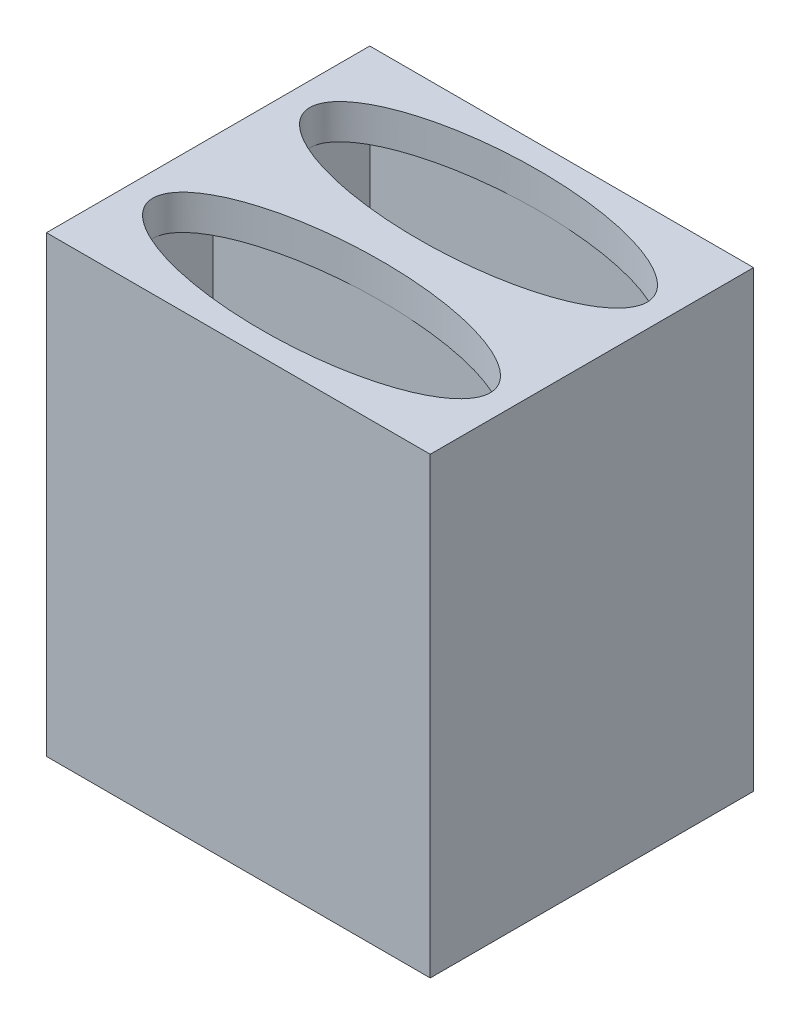
ISO-10303-21;
HEADER;
FILE_DESCRIPTION(('STEP AP214'),'2;1');
FILE_NAME('part.step','',(''),(''),'','','');
FILE_SCHEMA(('AUTOMOTIVE_DESIGN { 1 0 10303 214 1 1 1 1 }'));
ENDSEC;
DATA;
#1=APPLICATION_CONTEXT('core data for automotive mechanical design processes');
#2=APPLICATION_PROTOCOL_DEFINITION('international standard','automotive_design',2000,#1);
#3=PRODUCT_CONTEXT('',#1,'mechanical');
#4=PRODUCT('Part','Part','',(#3));
#5=PRODUCT_RELATED_PRODUCT_CATEGORY('part','',(#4));
#6=PRODUCT_DEFINITION_FORMATION('','',#4);
#7=PRODUCT_DEFINITION_CONTEXT('part definition',#1,'design');
#8=PRODUCT_DEFINITION('design','',#6,#7);
#9=PRODUCT_DEFINITION_SHAPE('','',#8);
#10=(LENGTH_UNIT() NAMED_UNIT(*) SI_UNIT(.MILLI.,.METRE.));
#11=(NAMED_UNIT(*) PLANE_ANGLE_UNIT() SI_UNIT($,.RADIAN.));
#12=(NAMED_UNIT(*) SI_UNIT($,.STERADIAN.) SOLID_ANGLE_UNIT());
#13=UNCERTAINTY_MEASURE_WITH_UNIT(LENGTH_MEASURE(1.E-05),#10,'distance_accuracy_value','');
#14=(GEOMETRIC_REPRESENTATION_CONTEXT(3) GLOBAL_UNCERTAINTY_ASSIGNED_CONTEXT((#13)) GLOBAL_UNIT_ASSIGNED_CONTEXT((#10,
#11,#12)) REPRESENTATION_CONTEXT('',''));
#15=CARTESIAN_POINT('',(0.,0.,0.));
#16=DIRECTION('',(0.,0.,1.));
#17=DIRECTION('',(1.,0.,0.));
#18=AXIS2_PLACEMENT_3D('',#15,#16,#17);
#19=CARTESIAN_POINT('',(0.,0.,0.));
#20=DIRECTION('',(0.,1.,0.));
#21=DIRECTION('',(0.,0.,1.));
#22=AXIS2_PLACEMENT_3D('',#19,#20,#21);
#23=PLANE('',#22);
#24=DIRECTION('',(1.,0.,0.));
#25=VECTOR('',#24,1.);
#26=CARTESIAN_POINT('',(-16.5,0.,20.65));
#27=LINE('',#26,#25);
#28=CARTESIAN_POINT('',(-16.5,0.,20.65));
#29=VERTEX_POINT('',#28);
#30=CARTESIAN_POINT('',(16.5,0.,20.65));
#31=VERTEX_POINT('',#30);
#32=EDGE_CURVE('E168',#29,#31,#27,.T.);
#33=ORIENTED_EDGE('',*,*,#32,.F.);
#34=DIRECTION('',(0.,0.,1.));
#35=VECTOR('',#34,1.);
#36=CARTESIAN_POINT('',(-16.5,0.,7.15));
#37=LINE('',#36,#35);
#38=CARTESIAN_POINT('',(-16.5,0.,-7.15));
#39=VERTEX_POINT('',#38);
#40=EDGE_CURVE('E163',#39,#29,#37,.T.);
#41=ORIENTED_EDGE('',*,*,#40,.F.);
#42=DIRECTION('',(-1.,0.,0.));
#43=VECTOR('',#42,1.);
#44=CARTESIAN_POINT('',(-16.5,0.,-7.15));
#45=LINE('',#44,#43);
#46=CARTESIAN_POINT('',(16.5,0.,-7.15));
#47=VERTEX_POINT('',#46);
#48=EDGE_CURVE('E274',#47,#39,#45,.T.);
#49=ORIENTED_EDGE('',*,*,#48,.F.);
#50=DIRECTION('',(0.,0.,-1.));
#51=VECTOR('',#50,1.);
#52=CARTESIAN_POINT('',(16.5,0.,7.15));
#53=LINE('',#52,#51);
#54=EDGE_CURVE('E276',#31,#47,#53,.T.);
#55=ORIENTED_EDGE('',*,*,#54,.F.);
#56=EDGE_LOOP('',(#33,#41,#49,#55));
#57=FACE_BOUND('',#56,.T.);
#58=DIRECTION('',(0.,0.,-1.));
#59=VECTOR('',#58,1.);
#60=CARTESIAN_POINT('',(14.5,0.,18.65));
#61=LINE('',#60,#59);
#62=CARTESIAN_POINT('',(14.5,0.,18.65));
#63=VERTEX_POINT('',#62);
#64=CARTESIAN_POINT('',(14.5,0.,8.35));
#65=VERTEX_POINT('',#64);
#66=EDGE_CURVE('E186',#63,#65,#61,.T.);
#67=ORIENTED_EDGE('',*,*,#66,.T.);
#68=DIRECTION('',(-1.,0.,0.));
#69=VECTOR('',#68,1.);
#70=CARTESIAN_POINT('',(-14.5,0.,8.35));
#71=LINE('',#70,#69);
#72=CARTESIAN_POINT('',(-14.5,0.,8.35));
#73=VERTEX_POINT('',#72);
#74=EDGE_CURVE('E204',#65,#73,#71,.T.);
#75=ORIENTED_EDGE('',*,*,#74,.T.);
#76=DIRECTION('',(0.,0.,1.));
#77=VECTOR('',#76,1.);
#78=CARTESIAN_POINT('',(-14.5,0.,18.65));
#79=LINE('',#78,#77);
#80=CARTESIAN_POINT('',(-14.5,0.,18.65));
#81=VERTEX_POINT('',#80);
#82=EDGE_CURVE('E207',#73,#81,#79,.T.);
#83=ORIENTED_EDGE('',*,*,#82,.T.);
#84=DIRECTION('',(1.,0.,0.));
#85=VECTOR('',#84,1.);
#86=CARTESIAN_POINT('',(-14.5,0.,18.65));
#87=LINE('',#86,#85);
#88=EDGE_CURVE('E191',#81,#63,#87,.T.);
#89=ORIENTED_EDGE('',*,*,#88,.T.);
#90=EDGE_LOOP('',(#67,#75,#83,#89));
#91=FACE_BOUND('',#90,.T.);
#92=DIRECTION('',(0.,0.,-1.));
#93=VECTOR('',#92,1.);
#94=CARTESIAN_POINT('',(14.5,0.,5.15));
#95=LINE('',#94,#93);
#96=CARTESIAN_POINT('',(14.5,0.,5.15));
#97=VERTEX_POINT('',#96);
#98=CARTESIAN_POINT('',(14.5,0.,-5.15));
#99=VERTEX_POINT('',#98);
#100=EDGE_CURVE('E157',#97,#99,#95,.T.);
#101=ORIENTED_EDGE('',*,*,#100,.T.);
#102=DIRECTION('',(-1.,0.,0.));
#103=VECTOR('',#102,1.);
#104=CARTESIAN_POINT('',(-14.5,0.,-5.15));
#105=LINE('',#104,#103);
#106=CARTESIAN_POINT('',(-14.5,0.,-5.15));
#107=VERTEX_POINT('',#106);
#108=EDGE_CURVE('E299',#99,#107,#105,.T.);
#109=ORIENTED_EDGE('',*,*,#108,.T.);
#110=DIRECTION('',(0.,0.,1.));
#111=VECTOR('',#110,1.);
#112=CARTESIAN_POINT('',(-14.5,0.,5.15));
#113=LINE('',#112,#111);
#114=CARTESIAN_POINT('',(-14.5,0.,5.15));
#115=VERTEX_POINT('',#114);
#116=EDGE_CURVE('E296',#107,#115,#113,.T.);
#117=ORIENTED_EDGE('',*,*,#116,.T.);
#118=DIRECTION('',(1.,0.,0.));
#119=VECTOR('',#118,1.);
#120=CARTESIAN_POINT('',(-14.5,0.,5.15));
#121=LINE('',#120,#119);
#122=EDGE_CURVE('E292',#115,#97,#121,.T.);
#123=ORIENTED_EDGE('',*,*,#122,.T.);
#124=EDGE_LOOP('',(#101,#109,#117,#123));
#125=FACE_BOUND('',#124,.T.);
#126=ADVANCED_FACE('F32',(#57,#91,#125),#23,.F.);
#127=CARTESIAN_POINT('',(16.5,36.,7.15));
#128=DIRECTION('',(-1.,0.,0.));
#129=DIRECTION('',(0.,0.,1.));
#130=AXIS2_PLACEMENT_3D('',#127,#128,#129);
#131=PLANE('',#130);
#132=DIRECTION('',(0.,0.,-1.));
#133=VECTOR('',#132,1.);
#134=CARTESIAN_POINT('',(16.5,39.,-7.15));
#135=LINE('',#134,#133);
#136=CARTESIAN_POINT('',(16.5,39.,20.65));
#137=VERTEX_POINT('',#136);
#138=CARTESIAN_POINT('',(16.5,39.,-7.15));
#139=VERTEX_POINT('',#138);
#140=EDGE_CURVE('E228',#137,#139,#135,.T.);
#141=ORIENTED_EDGE('',*,*,#140,.F.);
#142=DIRECTION('',(0.,-1.,0.));
#143=VECTOR('',#142,1.);
#144=CARTESIAN_POINT('',(16.5,36.,20.65));
#145=LINE('',#144,#143);
#146=EDGE_CURVE('E167',#137,#31,#145,.T.);
#147=ORIENTED_EDGE('',*,*,#146,.T.);
#148=ORIENTED_EDGE('',*,*,#54,.T.);
#149=DIRECTION('',(0.,-1.,0.));
#150=VECTOR('',#149,1.);
#151=CARTESIAN_POINT('',(16.5,36.,-7.15));
#152=LINE('',#151,#150);
#153=EDGE_CURVE('E11',#139,#47,#152,.T.);
#154=ORIENTED_EDGE('',*,*,#153,.F.);
#155=EDGE_LOOP('',(#141,#147,#148,#154));
#156=FACE_BOUND('',#155,.T.);
#157=ADVANCED_FACE('F34',(#156),#131,.F.);
#158=CARTESIAN_POINT('',(-16.5,36.,-7.15));
#159=DIRECTION('',(0.,0.,1.));
#160=DIRECTION('',(1.,0.,0.));
#161=AXIS2_PLACEMENT_3D('',#158,#159,#160);
#162=PLANE('',#161);
#163=ORIENTED_EDGE('',*,*,#48,.T.);
#164=DIRECTION('',(0.,-1.,0.));
#165=VECTOR('',#164,1.);
#166=CARTESIAN_POINT('',(-16.5,36.,-7.15));
#167=LINE('',#166,#165);
#168=CARTESIAN_POINT('',(-16.5,39.,-7.15));
#169=VERTEX_POINT('',#168);
#170=EDGE_CURVE('E40',#169,#39,#167,.T.);
#171=ORIENTED_EDGE('',*,*,#170,.F.);
#172=DIRECTION('',(-1.,0.,0.));
#173=VECTOR('',#172,1.);
#174=CARTESIAN_POINT('',(16.5,39.,-7.15));
#175=LINE('',#174,#173);
#176=EDGE_CURVE('E154',#139,#169,#175,.T.);
#177=ORIENTED_EDGE('',*,*,#176,.F.);
#178=ORIENTED_EDGE('',*,*,#153,.T.);
#179=EDGE_LOOP('',(#163,#171,#177,#178));
#180=FACE_BOUND('',#179,.T.);
#181=ADVANCED_FACE('F266',(#180),#162,.F.);
#182=CARTESIAN_POINT('',(-16.5,36.,7.15));
#183=DIRECTION('',(1.,0.,0.));
#184=DIRECTION('',(0.,0.,-1.));
#185=AXIS2_PLACEMENT_3D('',#182,#183,#184);
#186=PLANE('',#185);
#187=DIRECTION('',(0.,-1.,0.));
#188=VECTOR('',#187,1.);
#189=CARTESIAN_POINT('',(-16.5,36.,20.65));
#190=LINE('',#189,#188);
#191=CARTESIAN_POINT('',(-16.5,39.,20.65));
#192=VERTEX_POINT('',#191);
#193=EDGE_CURVE('E160',#192,#29,#190,.T.);
#194=ORIENTED_EDGE('',*,*,#193,.F.);
#195=DIRECTION('',(0.,0.,1.));
#196=VECTOR('',#195,1.);
#197=CARTESIAN_POINT('',(-16.5,39.,-7.15));
#198=LINE('',#197,#196);
#199=EDGE_CURVE('E147',#169,#192,#198,.T.);
#200=ORIENTED_EDGE('',*,*,#199,.F.);
#201=ORIENTED_EDGE('',*,*,#170,.T.);
#202=ORIENTED_EDGE('',*,*,#40,.T.);
#203=EDGE_LOOP('',(#194,#200,#201,#202));
#204=FACE_BOUND('',#203,.T.);
#205=ADVANCED_FACE('F161',(#204),#186,.F.);
#206=CARTESIAN_POINT('',(14.5,36.,5.15));
#207=DIRECTION('',(-1.,0.,0.));
#208=DIRECTION('',(0.,0.,1.));
#209=AXIS2_PLACEMENT_3D('',#206,#207,#208);
#210=PLANE('',#209);
#211=ORIENTED_EDGE('',*,*,#100,.F.);
#212=DIRECTION('',(0.,-1.,0.));
#213=VECTOR('',#212,1.);
#214=CARTESIAN_POINT('',(14.5,36.,5.15));
#215=LINE('',#214,#213);
#216=CARTESIAN_POINT('',(14.5,36.,5.15));
#217=VERTEX_POINT('',#216);
#218=EDGE_CURVE('E289',#217,#97,#215,.T.);
#219=ORIENTED_EDGE('',*,*,#218,.F.);
#220=DIRECTION('',(0.,0.,-1.));
#221=VECTOR('',#220,1.);
#222=CARTESIAN_POINT('',(14.5,36.,5.15));
#223=LINE('',#222,#221);
#224=CARTESIAN_POINT('',(14.5,36.,0.));
#225=VERTEX_POINT('',#224);
#226=EDGE_CURVE('E314',#217,#225,#223,.T.);
#227=ORIENTED_EDGE('',*,*,#226,.T.);
#228=CARTESIAN_POINT('',(14.5,36.,-5.15));
#229=VERTEX_POINT('',#228);
#230=EDGE_CURVE('E295',#225,#229,#223,.T.);
#231=ORIENTED_EDGE('',*,*,#230,.T.);
#232=DIRECTION('',(0.,-1.,0.));
#233=VECTOR('',#232,1.);
#234=CARTESIAN_POINT('',(14.5,36.,-5.15));
#235=LINE('',#234,#233);
#236=EDGE_CURVE('E282',#229,#99,#235,.T.);
#237=ORIENTED_EDGE('',*,*,#236,.T.);
#238=EDGE_LOOP('',(#211,#219,#227,#231,#237));
#239=FACE_BOUND('',#238,.T.);
#240=ADVANCED_FACE('F257',(#239),#210,.T.);
#241=CARTESIAN_POINT('',(-14.5,36.,-5.15));
#242=DIRECTION('',(0.,0.,1.));
#243=DIRECTION('',(1.,0.,0.));
#244=AXIS2_PLACEMENT_3D('',#241,#242,#243);
#245=PLANE('',#244);
#246=ORIENTED_EDGE('',*,*,#108,.F.);
#247=ORIENTED_EDGE('',*,*,#236,.F.);
#248=DIRECTION('',(-1.,0.,0.));
#249=VECTOR('',#248,1.);
#250=CARTESIAN_POINT('',(-14.5,36.,-5.15));
#251=LINE('',#250,#249);
#252=CARTESIAN_POINT('',(0.,36.,-5.15));
#253=VERTEX_POINT('',#252);
#254=EDGE_CURVE('E310',#229,#253,#251,.T.);
#255=ORIENTED_EDGE('',*,*,#254,.T.);
#256=CARTESIAN_POINT('',(-14.5,36.,-5.15));
#257=VERTEX_POINT('',#256);
#258=EDGE_CURVE('E313',#253,#257,#251,.T.);
#259=ORIENTED_EDGE('',*,*,#258,.T.);
#260=DIRECTION('',(0.,-1.,0.));
#261=VECTOR('',#260,1.);
#262=CARTESIAN_POINT('',(-14.5,36.,-5.15));
#263=LINE('',#262,#261);
#264=EDGE_CURVE('E285',#257,#107,#263,.T.);
#265=ORIENTED_EDGE('',*,*,#264,.T.);
#266=EDGE_LOOP('',(#246,#247,#255,#259,#265));
#267=FACE_BOUND('',#266,.T.);
#268=ADVANCED_FACE('F253',(#267),#245,.T.);
#269=CARTESIAN_POINT('',(-14.5,36.,5.15));
#270=DIRECTION('',(1.,0.,0.));
#271=DIRECTION('',(0.,0.,-1.));
#272=AXIS2_PLACEMENT_3D('',#269,#270,#271);
#273=PLANE('',#272);
#274=ORIENTED_EDGE('',*,*,#116,.F.);
#275=ORIENTED_EDGE('',*,*,#264,.F.);
#276=DIRECTION('',(0.,0.,1.));
#277=VECTOR('',#276,1.);
#278=CARTESIAN_POINT('',(-14.5,36.,5.15));
#279=LINE('',#278,#277);
#280=CARTESIAN_POINT('',(-14.5,36.,0.));
#281=VERTEX_POINT('',#280);
#282=EDGE_CURVE('E306',#257,#281,#279,.T.);
#283=ORIENTED_EDGE('',*,*,#282,.T.);
#284=CARTESIAN_POINT('',(-14.5,36.,5.15));
#285=VERTEX_POINT('',#284);
#286=EDGE_CURVE('E309',#281,#285,#279,.T.);
#287=ORIENTED_EDGE('',*,*,#286,.T.);
#288=DIRECTION('',(0.,-1.,0.));
#289=VECTOR('',#288,1.);
#290=CARTESIAN_POINT('',(-14.5,36.,5.15));
#291=LINE('',#290,#289);
#292=EDGE_CURVE('E287',#285,#115,#291,.T.);
#293=ORIENTED_EDGE('',*,*,#292,.T.);
#294=EDGE_LOOP('',(#274,#275,#283,#287,#293));
#295=FACE_BOUND('',#294,.T.);
#296=ADVANCED_FACE('F249',(#295),#273,.T.);
#297=CARTESIAN_POINT('',(-14.5,36.,5.15));
#298=DIRECTION('',(0.,0.,-1.));
#299=DIRECTION('',(-1.,0.,0.));
#300=AXIS2_PLACEMENT_3D('',#297,#298,#299);
#301=PLANE('',#300);
#302=ORIENTED_EDGE('',*,*,#122,.F.);
#303=ORIENTED_EDGE('',*,*,#292,.F.);
#304=DIRECTION('',(1.,0.,0.));
#305=VECTOR('',#304,1.);
#306=CARTESIAN_POINT('',(-14.5,36.,5.15));
#307=LINE('',#306,#305);
#308=CARTESIAN_POINT('',(0.,36.,5.15));
#309=VERTEX_POINT('',#308);
#310=EDGE_CURVE('E55',#285,#309,#307,.T.);
#311=ORIENTED_EDGE('',*,*,#310,.T.);
#312=EDGE_CURVE('E305',#309,#217,#307,.T.);
#313=ORIENTED_EDGE('',*,*,#312,.T.);
#314=ORIENTED_EDGE('',*,*,#218,.T.);
#315=EDGE_LOOP('',(#302,#303,#311,#313,#314));
#316=FACE_BOUND('',#315,.T.);
#317=ADVANCED_FACE('F245',(#316),#301,.T.);
#318=CARTESIAN_POINT('',(0.,36.,0.));
#319=DIRECTION('',(0.,-1.,0.));
#320=DIRECTION('',(0.,0.,-1.));
#321=AXIS2_PLACEMENT_3D('',#318,#319,#320);
#322=PLANE('',#321);
#323=ORIENTED_EDGE('',*,*,#226,.F.);
#324=ORIENTED_EDGE('',*,*,#312,.F.);
#325=CARTESIAN_POINT('',(0.,36.,0.));
#326=DIRECTION('',(0.,1.,0.));
#327=DIRECTION('',(1.,0.,0.));
#328=AXIS2_PLACEMENT_3D('',#325,#326,#327);
#329=ELLIPSE('',#328,14.5,5.15);
#330=EDGE_CURVE('E223',#309,#225,#329,.T.);
#331=ORIENTED_EDGE('',*,*,#330,.T.);
#332=EDGE_LOOP('',(#323,#324,#331));
#333=FACE_BOUND('',#332,.T.);
#334=ADVANCED_FACE('F241',(#333),#322,.T.);
#335=ORIENTED_EDGE('',*,*,#230,.F.);
#336=EDGE_CURVE('E229',#225,#253,#329,.T.);
#337=ORIENTED_EDGE('',*,*,#336,.T.);
#338=ORIENTED_EDGE('',*,*,#254,.F.);
#339=EDGE_LOOP('',(#335,#337,#338));
#340=FACE_BOUND('',#339,.T.);
#341=ADVANCED_FACE('F244',(#340),#322,.T.);
#342=ORIENTED_EDGE('',*,*,#258,.F.);
#343=EDGE_CURVE('E337',#253,#281,#329,.T.);
#344=ORIENTED_EDGE('',*,*,#343,.T.);
#345=ORIENTED_EDGE('',*,*,#282,.F.);
#346=EDGE_LOOP('',(#342,#344,#345));
#347=FACE_BOUND('',#346,.T.);
#348=ADVANCED_FACE('F340',(#347),#322,.T.);
#349=ORIENTED_EDGE('',*,*,#310,.F.);
#350=ORIENTED_EDGE('',*,*,#286,.F.);
#351=EDGE_CURVE('E335',#281,#309,#329,.T.);
#352=ORIENTED_EDGE('',*,*,#351,.T.);
#353=EDGE_LOOP('',(#349,#350,#352));
#354=FACE_BOUND('',#353,.T.);
#355=ADVANCED_FACE('F240',(#354),#322,.T.);
#356=CARTESIAN_POINT('',(0.,39.,0.));
#357=DIRECTION('',(0.,-1.,0.));
#358=DIRECTION('',(0.,0.,-1.));
#359=AXIS2_PLACEMENT_3D('',#356,#357,#358);
#360=PLANE('',#359);
#361=ORIENTED_EDGE('',*,*,#140,.T.);
#362=ORIENTED_EDGE('',*,*,#176,.T.);
#363=ORIENTED_EDGE('',*,*,#199,.T.);
#364=DIRECTION('',(1.,0.,0.));
#365=VECTOR('',#364,1.);
#366=CARTESIAN_POINT('',(16.5,39.,20.65));
#367=LINE('',#366,#365);
#368=EDGE_CURVE('E152',#192,#137,#367,.T.);
#369=ORIENTED_EDGE('',*,*,#368,.T.);
#370=EDGE_LOOP('',(#361,#362,#363,#369));
#371=FACE_BOUND('',#370,.T.);
#372=CARTESIAN_POINT('',(0.,39.,0.));
#373=DIRECTION('',(0.,1.,0.));
#374=DIRECTION('',(1.,0.,0.));
#375=AXIS2_PLACEMENT_3D('',#372,#373,#374);
#376=ELLIPSE('',#375,14.5,5.15);
#377=CARTESIAN_POINT('',(14.5,39.,0.));
#378=VERTEX_POINT('',#377);
#379=EDGE_CURVE('E224',#378,#378,#376,.T.);
#380=ORIENTED_EDGE('',*,*,#379,.F.);
#381=EDGE_LOOP('',(#380));
#382=FACE_BOUND('',#381,.T.);
#383=CARTESIAN_POINT('',(0.,39.,13.5));
#384=DIRECTION('',(0.,1.,0.));
#385=DIRECTION('',(1.,0.,0.));
#386=AXIS2_PLACEMENT_3D('',#383,#384,#385);
#387=ELLIPSE('',#386,14.5,5.15);
#388=CARTESIAN_POINT('',(14.5,39.,13.5));
#389=VERTEX_POINT('',#388);
#390=EDGE_CURVE('E174',#389,#389,#387,.T.);
#391=ORIENTED_EDGE('',*,*,#390,.F.);
#392=EDGE_LOOP('',(#391));
#393=FACE_BOUND('',#392,.T.);
#394=ADVANCED_FACE('F149',(#371,#382,#393),#360,.F.);
#395=DIRECTION('',(0.,-1.,0.));
#396=VECTOR('',#395,1.);
#397=SURFACE_OF_LINEAR_EXTRUSION('',#376,#396);
#398=ORIENTED_EDGE('',*,*,#379,.T.);
#399=EDGE_LOOP('',(#398));
#400=FACE_BOUND('',#399,.T.);
#401=ORIENTED_EDGE('',*,*,#336,.F.);
#402=ORIENTED_EDGE('',*,*,#330,.F.);
#403=ORIENTED_EDGE('',*,*,#351,.F.);
#404=ORIENTED_EDGE('',*,*,#343,.F.);
#405=EDGE_LOOP('',(#401,#402,#403,#404));
#406=FACE_BOUND('',#405,.T.);
#407=ADVANCED_FACE('F232',(#400,#406),#397,.T.);
#408=CARTESIAN_POINT('',(-16.5,36.,20.65));
#409=DIRECTION('',(0.,0.,-1.));
#410=DIRECTION('',(-1.,0.,0.));
#411=AXIS2_PLACEMENT_3D('',#408,#409,#410);
#412=PLANE('',#411);
#413=ORIENTED_EDGE('',*,*,#32,.T.);
#414=ORIENTED_EDGE('',*,*,#146,.F.);
#415=ORIENTED_EDGE('',*,*,#368,.F.);
#416=ORIENTED_EDGE('',*,*,#193,.T.);
#417=EDGE_LOOP('',(#413,#414,#415,#416));
#418=FACE_BOUND('',#417,.T.);
#419=ADVANCED_FACE('F171',(#418),#412,.F.);
#420=CARTESIAN_POINT('',(14.5,36.,18.65));
#421=DIRECTION('',(-1.,0.,0.));
#422=DIRECTION('',(0.,0.,1.));
#423=AXIS2_PLACEMENT_3D('',#420,#421,#422);
#424=PLANE('',#423);
#425=ORIENTED_EDGE('',*,*,#66,.F.);
#426=DIRECTION('',(0.,-1.,0.));
#427=VECTOR('',#426,1.);
#428=CARTESIAN_POINT('',(14.5,36.,18.65));
#429=LINE('',#428,#427);
#430=CARTESIAN_POINT('',(14.5,36.,18.65));
#431=VERTEX_POINT('',#430);
#432=EDGE_CURVE('E201',#431,#63,#429,.T.);
#433=ORIENTED_EDGE('',*,*,#432,.F.);
#434=DIRECTION('',(0.,0.,-1.));
#435=VECTOR('',#434,1.);
#436=CARTESIAN_POINT('',(14.5,36.,18.65));
#437=LINE('',#436,#435);
#438=CARTESIAN_POINT('',(14.5,36.,13.5));
#439=VERTEX_POINT('',#438);
#440=EDGE_CURVE('E187',#431,#439,#437,.T.);
#441=ORIENTED_EDGE('',*,*,#440,.T.);
#442=DIRECTION('',(0.,0.,1.));
#443=VECTOR('',#442,1.);
#444=CARTESIAN_POINT('',(14.5,36.,18.65));
#445=LINE('',#444,#443);
#446=CARTESIAN_POINT('',(14.5,36.,8.35));
#447=VERTEX_POINT('',#446);
#448=EDGE_CURVE('E176',#447,#439,#445,.T.);
#449=ORIENTED_EDGE('',*,*,#448,.F.);
#450=DIRECTION('',(0.,-1.,0.));
#451=VECTOR('',#450,1.);
#452=CARTESIAN_POINT('',(14.5,36.,8.35));
#453=LINE('',#452,#451);
#454=EDGE_CURVE('E218',#447,#65,#453,.T.);
#455=ORIENTED_EDGE('',*,*,#454,.T.);
#456=EDGE_LOOP('',(#425,#433,#441,#449,#455));
#457=FACE_BOUND('',#456,.T.);
#458=ADVANCED_FACE('F365',(#457),#424,.T.);
#459=CARTESIAN_POINT('',(-14.5,36.,8.35));
#460=DIRECTION('',(0.,0.,1.));
#461=DIRECTION('',(1.,0.,0.));
#462=AXIS2_PLACEMENT_3D('',#459,#460,#461);
#463=PLANE('',#462);
#464=ORIENTED_EDGE('',*,*,#74,.F.);
#465=ORIENTED_EDGE('',*,*,#454,.F.);
#466=DIRECTION('',(-1.,0.,0.));
#467=VECTOR('',#466,1.);
#468=CARTESIAN_POINT('',(-14.5,36.,8.35));
#469=LINE('',#468,#467);
#470=CARTESIAN_POINT('',(0.,36.,8.35));
#471=VERTEX_POINT('',#470);
#472=EDGE_CURVE('E190',#447,#471,#469,.T.);
#473=ORIENTED_EDGE('',*,*,#472,.T.);
#474=DIRECTION('',(1.,0.,0.));
#475=VECTOR('',#474,1.);
#476=CARTESIAN_POINT('',(-14.5,36.,8.35));
#477=LINE('',#476,#475);
#478=CARTESIAN_POINT('',(-14.5,36.,8.35));
#479=VERTEX_POINT('',#478);
#480=EDGE_CURVE('E184',#479,#471,#477,.T.);
#481=ORIENTED_EDGE('',*,*,#480,.F.);
#482=DIRECTION('',(0.,-1.,0.));
#483=VECTOR('',#482,1.);
#484=CARTESIAN_POINT('',(-14.5,36.,8.35));
#485=LINE('',#484,#483);
#486=EDGE_CURVE('E216',#479,#73,#485,.T.);
#487=ORIENTED_EDGE('',*,*,#486,.T.);
#488=EDGE_LOOP('',(#464,#465,#473,#481,#487));
#489=FACE_BOUND('',#488,.T.);
#490=ADVANCED_FACE('F371',(#489),#463,.T.);
#491=CARTESIAN_POINT('',(-14.5,36.,18.65));
#492=DIRECTION('',(1.,0.,0.));
#493=DIRECTION('',(0.,0.,-1.));
#494=AXIS2_PLACEMENT_3D('',#491,#492,#493);
#495=PLANE('',#494);
#496=ORIENTED_EDGE('',*,*,#82,.F.);
#497=ORIENTED_EDGE('',*,*,#486,.F.);
#498=DIRECTION('',(0.,0.,1.));
#499=VECTOR('',#498,1.);
#500=CARTESIAN_POINT('',(-14.5,36.,18.65));
#501=LINE('',#500,#499);
#502=CARTESIAN_POINT('',(-14.5,36.,13.5));
#503=VERTEX_POINT('',#502);
#504=EDGE_CURVE('E194',#479,#503,#501,.T.);
#505=ORIENTED_EDGE('',*,*,#504,.T.);
#506=DIRECTION('',(0.,0.,-1.));
#507=VECTOR('',#506,1.);
#508=CARTESIAN_POINT('',(-14.5,36.,18.65));
#509=LINE('',#508,#507);
#510=CARTESIAN_POINT('',(-14.5,36.,18.65));
#511=VERTEX_POINT('',#510);
#512=EDGE_CURVE('E173',#511,#503,#509,.T.);
#513=ORIENTED_EDGE('',*,*,#512,.F.);
#514=DIRECTION('',(0.,-1.,0.));
#515=VECTOR('',#514,1.);
#516=CARTESIAN_POINT('',(-14.5,36.,18.65));
#517=LINE('',#516,#515);
#518=EDGE_CURVE('E214',#511,#81,#517,.T.);
#519=ORIENTED_EDGE('',*,*,#518,.T.);
#520=EDGE_LOOP('',(#496,#497,#505,#513,#519));
#521=FACE_BOUND('',#520,.T.);
#522=ADVANCED_FACE('F378',(#521),#495,.T.);
#523=CARTESIAN_POINT('',(-14.5,36.,18.65));
#524=DIRECTION('',(0.,0.,-1.));
#525=DIRECTION('',(-1.,0.,0.));
#526=AXIS2_PLACEMENT_3D('',#523,#524,#525);
#527=PLANE('',#526);
#528=ORIENTED_EDGE('',*,*,#88,.F.);
#529=ORIENTED_EDGE('',*,*,#518,.F.);
#530=DIRECTION('',(1.,0.,0.));
#531=VECTOR('',#530,1.);
#532=CARTESIAN_POINT('',(-14.5,36.,18.65));
#533=LINE('',#532,#531);
#534=CARTESIAN_POINT('',(0.,36.,18.65));
#535=VERTEX_POINT('',#534);
#536=EDGE_CURVE('E198',#511,#535,#533,.T.);
#537=ORIENTED_EDGE('',*,*,#536,.T.);
#538=EDGE_CURVE('E197',#535,#431,#533,.T.);
#539=ORIENTED_EDGE('',*,*,#538,.T.);
#540=ORIENTED_EDGE('',*,*,#432,.T.);
#541=EDGE_LOOP('',(#528,#529,#537,#539,#540));
#542=FACE_BOUND('',#541,.T.);
#543=ADVANCED_FACE('F386',(#542),#527,.T.);
#544=CARTESIAN_POINT('',(0.,36.,13.5));
#545=DIRECTION('',(0.,-1.,0.));
#546=DIRECTION('',(0.,0.,-1.));
#547=AXIS2_PLACEMENT_3D('',#544,#545,#546);
#548=PLANE('',#547);
#549=ORIENTED_EDGE('',*,*,#504,.F.);
#550=ORIENTED_EDGE('',*,*,#480,.T.);
#551=CARTESIAN_POINT('',(0.,36.,13.5));
#552=DIRECTION('',(0.,1.,0.));
#553=DIRECTION('',(1.,0.,0.));
#554=AXIS2_PLACEMENT_3D('',#551,#552,#553);
#555=ELLIPSE('',#554,14.5,5.15);
#556=EDGE_CURVE('E557',#471,#503,#555,.T.);
#557=ORIENTED_EDGE('',*,*,#556,.T.);
#558=EDGE_LOOP('',(#549,#550,#557));
#559=FACE_BOUND('',#558,.T.);
#560=ADVANCED_FACE('F394',(#559),#548,.T.);
#561=EDGE_CURVE('E179',#439,#471,#555,.T.);
#562=ORIENTED_EDGE('',*,*,#561,.T.);
#563=ORIENTED_EDGE('',*,*,#472,.F.);
#564=ORIENTED_EDGE('',*,*,#448,.T.);
#565=EDGE_LOOP('',(#562,#563,#564));
#566=FACE_BOUND('',#565,.T.);
#567=ADVANCED_FACE('F402',(#566),#548,.T.);
#568=EDGE_CURVE('E554',#535,#439,#555,.T.);
#569=ORIENTED_EDGE('',*,*,#568,.T.);
#570=ORIENTED_EDGE('',*,*,#440,.F.);
#571=ORIENTED_EDGE('',*,*,#538,.F.);
#572=EDGE_LOOP('',(#569,#570,#571));
#573=FACE_BOUND('',#572,.T.);
#574=ADVANCED_FACE('F411',(#573),#548,.T.);
#575=ORIENTED_EDGE('',*,*,#536,.F.);
#576=ORIENTED_EDGE('',*,*,#512,.T.);
#577=EDGE_CURVE('E47',#503,#535,#555,.T.);
#578=ORIENTED_EDGE('',*,*,#577,.T.);
#579=EDGE_LOOP('',(#575,#576,#578));
#580=FACE_BOUND('',#579,.T.);
#581=ADVANCED_FACE('F405',(#580),#548,.T.);
#582=DIRECTION('',(0.,-1.,0.));
#583=VECTOR('',#582,1.);
#584=SURFACE_OF_LINEAR_EXTRUSION('',#387,#583);
#585=ORIENTED_EDGE('',*,*,#390,.T.);
#586=EDGE_LOOP('',(#585));
#587=FACE_BOUND('',#586,.T.);
#588=ORIENTED_EDGE('',*,*,#561,.F.);
#589=ORIENTED_EDGE('',*,*,#568,.F.);
#590=ORIENTED_EDGE('',*,*,#577,.F.);
#591=ORIENTED_EDGE('',*,*,#556,.F.);
#592=EDGE_LOOP('',(#588,#589,#590,#591));
#593=FACE_BOUND('',#592,.T.);
#594=ADVANCED_FACE('F424',(#587,#593),#584,.T.);
#595=CLOSED_SHELL('',(#126,#157,#181,#205,#240,#268,#296,#317,#334,#341,#348,#355,#394,#407,
#419,#458,#490,#522,#543,#560,#567,#574,#581,#594));
#596=MANIFOLD_SOLID_BREP('B2',#595);
#597=ADVANCED_BREP_SHAPE_REPRESENTATION('',(#18,#596),#14);
#598=SHAPE_DEFINITION_REPRESENTATION(#9,#597);
ENDSEC;
END-ISO-10303-21;
